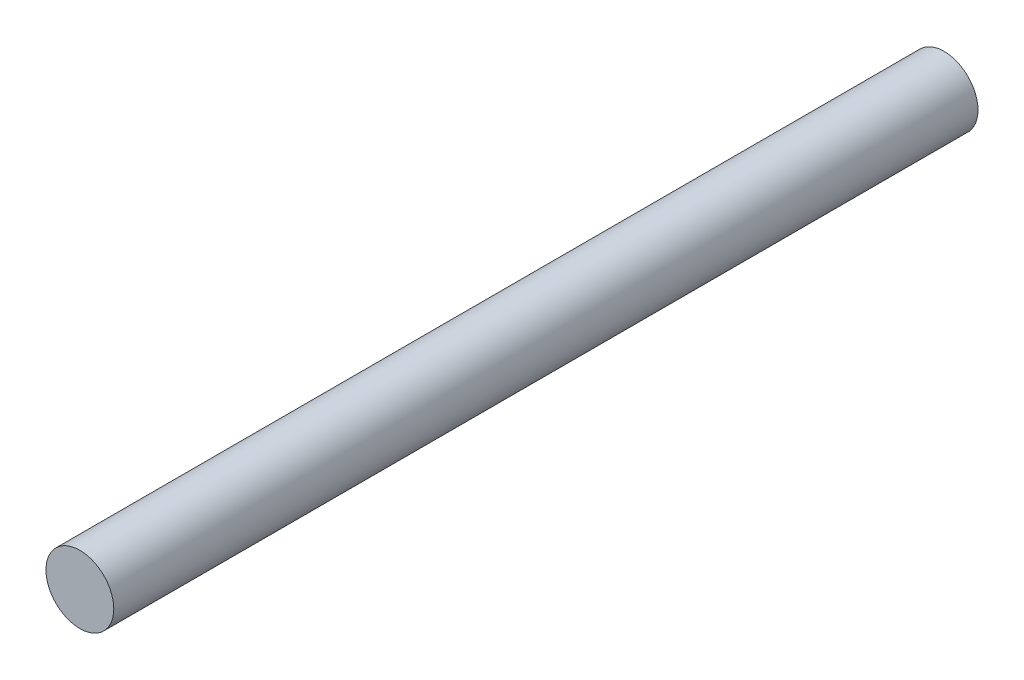
ISO-10303-21;
HEADER;
FILE_DESCRIPTION(('STEP AP214'),'2;1');
FILE_NAME('part.step','',(''),(''),'','','');
FILE_SCHEMA(('AUTOMOTIVE_DESIGN { 1 0 10303 214 1 1 1 1 }'));
ENDSEC;
DATA;
#1=APPLICATION_CONTEXT('core data for automotive mechanical design processes');
#2=APPLICATION_PROTOCOL_DEFINITION('international standard','automotive_design',2000,#1);
#3=PRODUCT_CONTEXT('',#1,'mechanical');
#4=PRODUCT('Part','Part','',(#3));
#5=PRODUCT_RELATED_PRODUCT_CATEGORY('part','',(#4));
#6=PRODUCT_DEFINITION_FORMATION('','',#4);
#7=PRODUCT_DEFINITION_CONTEXT('part definition',#1,'design');
#8=PRODUCT_DEFINITION('design','',#6,#7);
#9=PRODUCT_DEFINITION_SHAPE('','',#8);
#10=(LENGTH_UNIT() NAMED_UNIT(*) SI_UNIT(.MILLI.,.METRE.));
#11=(NAMED_UNIT(*) PLANE_ANGLE_UNIT() SI_UNIT($,.RADIAN.));
#12=(NAMED_UNIT(*) SI_UNIT($,.STERADIAN.) SOLID_ANGLE_UNIT());
#13=UNCERTAINTY_MEASURE_WITH_UNIT(LENGTH_MEASURE(1.E-05),#10,'distance_accuracy_value','');
#14=(GEOMETRIC_REPRESENTATION_CONTEXT(3) GLOBAL_UNCERTAINTY_ASSIGNED_CONTEXT((#13)) GLOBAL_UNIT_ASSIGNED_CONTEXT((#10,
#11,#12)) REPRESENTATION_CONTEXT('',''));
#15=CARTESIAN_POINT('',(0.,0.,0.));
#16=DIRECTION('',(0.,0.,1.));
#17=DIRECTION('',(1.,0.,0.));
#18=AXIS2_PLACEMENT_3D('',#15,#16,#17);
#19=CARTESIAN_POINT('',(0.,0.,-25.4));
#20=DIRECTION('',(0.,0.,1.));
#21=DIRECTION('',(1.,0.,0.));
#22=AXIS2_PLACEMENT_3D('',#19,#20,#21);
#23=CYLINDRICAL_SURFACE('',#22,1.9939);
#24=CARTESIAN_POINT('',(0.,0.,-25.4));
#25=DIRECTION('',(0.,0.,1.));
#26=DIRECTION('',(1.,0.,0.));
#27=AXIS2_PLACEMENT_3D('',#24,#25,#26);
#28=CIRCLE('',#27,1.9939);
#29=CARTESIAN_POINT('',(1.99390000000001,0.,-25.4));
#30=VERTEX_POINT('',#29);
#31=EDGE_CURVE('E12',#30,#30,#28,.T.);
#32=CARTESIAN_POINT('',(0.,0.,25.4));
#33=DIRECTION('',(0.,0.,1.));
#34=DIRECTION('',(1.,0.,0.));
#35=AXIS2_PLACEMENT_3D('',#32,#33,#34);
#36=CIRCLE('',#35,1.9939);
#37=CARTESIAN_POINT('',(1.99390000000001,0.,25.4));
#38=VERTEX_POINT('',#37);
#39=EDGE_CURVE('E46',#38,#38,#36,.T.);
#40=CARTESIAN_POINT('',(1.99390000000001,0.,-25.4));
#41=CARTESIAN_POINT('',(1.99390000000001,0.,-24.8708333333333));
#42=CARTESIAN_POINT('',(1.99390000000001,0.,-24.3416666666667));
#43=CARTESIAN_POINT('',(1.99390000000001,0.,-23.2833333333333));
#44=CARTESIAN_POINT('',(1.99390000000001,0.,-22.7541666666667));
#45=CARTESIAN_POINT('',(1.99390000000001,0.,-21.6958333333333));
#46=CARTESIAN_POINT('',(1.99390000000001,0.,-21.1666666666667));
#47=CARTESIAN_POINT('',(1.99390000000001,0.,-20.1083333333333));
#48=CARTESIAN_POINT('',(1.99390000000001,0.,-19.5791666666667));
#49=CARTESIAN_POINT('',(1.99390000000001,0.,-18.5208333333333));
#50=CARTESIAN_POINT('',(1.99390000000001,0.,-17.9916666666667));
#51=CARTESIAN_POINT('',(1.99390000000001,0.,-16.9333333333333));
#52=CARTESIAN_POINT('',(1.99390000000001,0.,-16.4041666666667));
#53=CARTESIAN_POINT('',(1.99390000000001,0.,-15.3458333333333));
#54=CARTESIAN_POINT('',(1.99390000000001,0.,-14.8166666666667));
#55=CARTESIAN_POINT('',(1.99390000000001,0.,-13.7583333333333));
#56=CARTESIAN_POINT('',(1.99390000000001,0.,-13.2291666666667));
#57=CARTESIAN_POINT('',(1.99390000000001,0.,-12.1708333333333));
#58=CARTESIAN_POINT('',(1.99390000000001,0.,-11.6416666666667));
#59=CARTESIAN_POINT('',(1.99390000000001,0.,-10.5833333333333));
#60=CARTESIAN_POINT('',(1.99390000000001,0.,-10.0541666666667));
#61=CARTESIAN_POINT('',(1.99390000000001,0.,-8.99583333333333));
#62=CARTESIAN_POINT('',(1.99390000000001,0.,-8.46666666666667));
#63=CARTESIAN_POINT('',(1.99390000000001,0.,-7.40833333333333));
#64=CARTESIAN_POINT('',(1.99390000000001,0.,-6.87916666666667));
#65=CARTESIAN_POINT('',(1.99390000000001,0.,-5.82083333333333));
#66=CARTESIAN_POINT('',(1.99390000000001,0.,-5.29166666666666));
#67=CARTESIAN_POINT('',(1.99390000000001,0.,-4.23333333333333));
#68=CARTESIAN_POINT('',(1.99390000000001,0.,-3.70416666666666));
#69=CARTESIAN_POINT('',(1.99390000000001,0.,-2.64583333333333));
#70=CARTESIAN_POINT('',(1.99390000000001,0.,-2.11666666666666));
#71=CARTESIAN_POINT('',(1.99390000000001,0.,-1.05833333333333));
#72=CARTESIAN_POINT('',(1.99390000000001,0.,-0.52916666666666));
#73=CARTESIAN_POINT('',(1.99390000000001,0.,0.529166666666674));
#74=CARTESIAN_POINT('',(1.99390000000001,0.,1.05833333333334));
#75=CARTESIAN_POINT('',(1.99390000000001,0.,2.11666666666668));
#76=CARTESIAN_POINT('',(1.99390000000001,0.,2.64583333333334));
#77=CARTESIAN_POINT('',(1.99390000000001,0.,3.70416666666668));
#78=CARTESIAN_POINT('',(1.99390000000001,0.,4.23333333333334));
#79=CARTESIAN_POINT('',(1.99390000000001,0.,5.29166666666668));
#80=CARTESIAN_POINT('',(1.99390000000001,0.,5.82083333333335));
#81=CARTESIAN_POINT('',(1.99390000000001,0.,6.87916666666668));
#82=CARTESIAN_POINT('',(1.99390000000001,0.,7.40833333333335));
#83=CARTESIAN_POINT('',(1.99390000000001,0.,8.46666666666668));
#84=CARTESIAN_POINT('',(1.99390000000001,0.,8.99583333333335));
#85=CARTESIAN_POINT('',(1.99390000000001,0.,10.0541666666667));
#86=CARTESIAN_POINT('',(1.99390000000001,0.,10.5833333333333));
#87=CARTESIAN_POINT('',(1.99390000000001,0.,11.6416666666667));
#88=CARTESIAN_POINT('',(1.99390000000001,0.,12.1708333333334));
#89=CARTESIAN_POINT('',(1.99390000000001,0.,13.2291666666667));
#90=CARTESIAN_POINT('',(1.99390000000001,0.,13.7583333333334));
#91=CARTESIAN_POINT('',(1.99390000000001,0.,14.8166666666667));
#92=CARTESIAN_POINT('',(1.99390000000001,0.,15.3458333333334));
#93=CARTESIAN_POINT('',(1.99390000000001,0.,16.4041666666667));
#94=CARTESIAN_POINT('',(1.99390000000001,0.,16.9333333333334));
#95=CARTESIAN_POINT('',(1.99390000000001,0.,17.9916666666667));
#96=CARTESIAN_POINT('',(1.99390000000001,0.,18.5208333333333));
#97=CARTESIAN_POINT('',(1.99390000000001,0.,19.5791666666667));
#98=CARTESIAN_POINT('',(1.99390000000001,0.,20.1083333333334));
#99=CARTESIAN_POINT('',(1.99390000000001,0.,21.1666666666667));
#100=CARTESIAN_POINT('',(1.99390000000001,0.,21.6958333333334));
#101=CARTESIAN_POINT('',(1.99390000000001,0.,22.7541666666667));
#102=CARTESIAN_POINT('',(1.99390000000001,0.,23.2833333333334));
#103=CARTESIAN_POINT('',(1.99390000000001,0.,24.3416666666667));
#104=CARTESIAN_POINT('',(1.99390000000001,0.,24.8708333333334));
#105=CARTESIAN_POINT('',(1.99390000000001,0.,25.4));
#106=B_SPLINE_CURVE_WITH_KNOTS('',3,(#40,#41,#42,#43,#44,#45,#46,#47,#48,#49,#50,#51,#52,#53,
#54,#55,#56,#57,#58,#59,#60,#61,#62,#63,#64,#65,#66,#67,#68,#69,#70,#71,#72,#73,#74,#75,#76,#77,
#78,#79,#80,#81,#82,#83,#84,#85,#86,#87,#88,#89,#90,#91,#92,#93,#94,#95,#96,#97,#98,#99,#100,
#101,#102,#103,#104,#105),.UNSPECIFIED.,.F.,.F.,(4,2,2,2,2,2,2,2,2,2,2,2,2,2,2,2,2,2,2,2,2,2,2,
2,2,2,2,2,2,2,2,2,4),(0.,1.5875,3.175,4.76250000000001,6.35,7.93750000000001,9.52500000000001,
11.1125,12.7,14.2875,15.875,17.4625,19.05,20.6375,22.225,23.8125,25.4,26.9875,28.575,30.1625,
31.75,33.3375,34.925,36.5125,38.1,39.6875,41.275,42.8625,44.45,46.0375,47.625,49.2125,50.8),.UNSPECIFIED.);
#107=EDGE_CURVE('BSEAM40',#30,#38,#106,.T.);
#108=ORIENTED_EDGE('',*,*,#31,.T.);
#109=ORIENTED_EDGE('',*,*,#39,.F.);
#110=ORIENTED_EDGE('',*,*,#107,.T.);
#111=ORIENTED_EDGE('',*,*,#107,.F.);
#112=EDGE_LOOP('',(#108,#110,#109,#111));
#113=FACE_BOUND('',#112,.T.);
#114=ADVANCED_FACE('F40',(#113),#23,.T.);
#115=CARTESIAN_POINT('',(0.,0.,-25.4));
#116=DIRECTION('',(0.,0.,1.));
#117=DIRECTION('',(1.,0.,0.));
#118=AXIS2_PLACEMENT_3D('',#115,#116,#117);
#119=PLANE('',#118);
#120=ORIENTED_EDGE('',*,*,#31,.F.);
#121=EDGE_LOOP('',(#120));
#122=FACE_BOUND('',#121,.T.);
#123=ADVANCED_FACE('F55',(#122),#119,.F.);
#124=CARTESIAN_POINT('',(0.,0.,25.4));
#125=DIRECTION('',(0.,0.,1.));
#126=DIRECTION('',(1.,0.,0.));
#127=AXIS2_PLACEMENT_3D('',#124,#125,#126);
#128=PLANE('',#127);
#129=ORIENTED_EDGE('',*,*,#39,.T.);
#130=EDGE_LOOP('',(#129));
#131=FACE_BOUND('',#130,.T.);
#132=ADVANCED_FACE('F52',(#131),#128,.T.);
#133=CLOSED_SHELL('',(#114,#123,#132));
#134=MANIFOLD_SOLID_BREP('B2',#133);
#135=ADVANCED_BREP_SHAPE_REPRESENTATION('',(#18,#134),#14);
#136=SHAPE_DEFINITION_REPRESENTATION(#9,#135);
ENDSEC;
END-ISO-10303-21;
